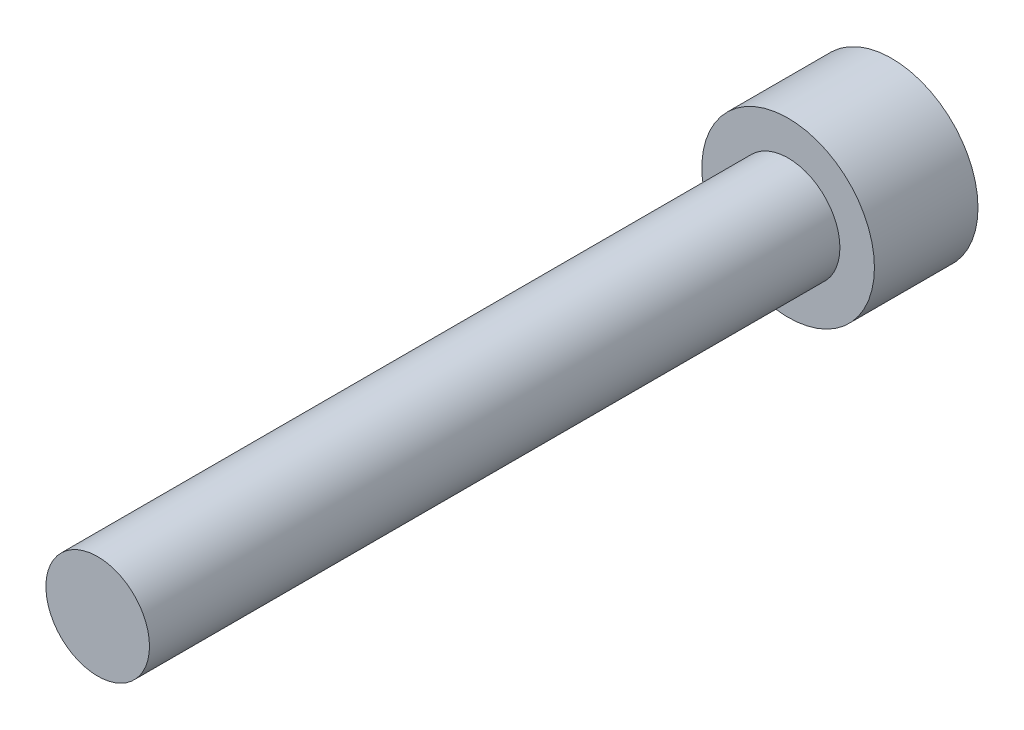
ISO-10303-21;
HEADER;
FILE_DESCRIPTION(('STEP AP214'),'2;1');
FILE_NAME('part.step','',(''),(''),'','','');
FILE_SCHEMA(('AUTOMOTIVE_DESIGN { 1 0 10303 214 1 1 1 1 }'));
ENDSEC;
DATA;
#1=APPLICATION_CONTEXT('core data for automotive mechanical design processes');
#2=APPLICATION_PROTOCOL_DEFINITION('international standard','automotive_design',2000,#1);
#3=PRODUCT_CONTEXT('',#1,'mechanical');
#4=PRODUCT('Part','Part','',(#3));
#5=PRODUCT_RELATED_PRODUCT_CATEGORY('part','',(#4));
#6=PRODUCT_DEFINITION_FORMATION('','',#4);
#7=PRODUCT_DEFINITION_CONTEXT('part definition',#1,'design');
#8=PRODUCT_DEFINITION('design','',#6,#7);
#9=PRODUCT_DEFINITION_SHAPE('','',#8);
#10=(LENGTH_UNIT() NAMED_UNIT(*) SI_UNIT(.MILLI.,.METRE.));
#11=(NAMED_UNIT(*) PLANE_ANGLE_UNIT() SI_UNIT($,.RADIAN.));
#12=(NAMED_UNIT(*) SI_UNIT($,.STERADIAN.) SOLID_ANGLE_UNIT());
#13=UNCERTAINTY_MEASURE_WITH_UNIT(LENGTH_MEASURE(1.E-05),#10,'distance_accuracy_value','');
#14=(GEOMETRIC_REPRESENTATION_CONTEXT(3) GLOBAL_UNCERTAINTY_ASSIGNED_CONTEXT((#13)) GLOBAL_UNIT_ASSIGNED_CONTEXT((#10,
#11,#12)) REPRESENTATION_CONTEXT('',''));
#15=CARTESIAN_POINT('',(0.,0.,0.));
#16=DIRECTION('',(0.,0.,1.));
#17=DIRECTION('',(1.,0.,0.));
#18=AXIS2_PLACEMENT_3D('',#15,#16,#17);
#19=CARTESIAN_POINT('',(0.,0.,6.));
#20=DIRECTION('',(0.,0.,1.));
#21=DIRECTION('',(1.,0.,0.));
#22=AXIS2_PLACEMENT_3D('',#19,#20,#21);
#23=PLANE('',#22);
#24=CARTESIAN_POINT('',(0.,0.,6.));
#25=DIRECTION('',(0.,0.,1.));
#26=DIRECTION('',(1.,0.,0.));
#27=AXIS2_PLACEMENT_3D('',#24,#25,#26);
#28=CIRCLE('',#27,5.);
#29=CARTESIAN_POINT('',(5.,0.,6.));
#30=VERTEX_POINT('',#29);
#31=EDGE_CURVE('E11',#30,#30,#28,.T.);
#32=ORIENTED_EDGE('',*,*,#31,.T.);
#33=EDGE_LOOP('',(#32));
#34=FACE_BOUND('',#33,.T.);
#35=CARTESIAN_POINT('',(0.,0.,6.));
#36=DIRECTION('',(0.,0.,1.));
#37=DIRECTION('',(1.,0.,0.));
#38=AXIS2_PLACEMENT_3D('',#35,#36,#37);
#39=CIRCLE('',#38,3.);
#40=CARTESIAN_POINT('',(3.,0.,6.));
#41=VERTEX_POINT('',#40);
#42=EDGE_CURVE('E139',#41,#41,#39,.T.);
#43=ORIENTED_EDGE('',*,*,#42,.F.);
#44=EDGE_LOOP('',(#43));
#45=FACE_BOUND('',#44,.T.);
#46=ADVANCED_FACE('F37',(#34,#45),#23,.T.);
#47=CARTESIAN_POINT('',(0.,0.,6.));
#48=DIRECTION('',(0.,0.,-1.));
#49=DIRECTION('',(-1.,0.,0.));
#50=AXIS2_PLACEMENT_3D('',#47,#48,#49);
#51=CYLINDRICAL_SURFACE('',#50,5.);
#52=ORIENTED_EDGE('',*,*,#31,.F.);
#53=EDGE_LOOP('',(#52));
#54=FACE_BOUND('',#53,.T.);
#55=CARTESIAN_POINT('',(0.,0.,0.));
#56=DIRECTION('',(0.,0.,1.));
#57=DIRECTION('',(1.,0.,0.));
#58=AXIS2_PLACEMENT_3D('',#55,#56,#57);
#59=CIRCLE('',#58,5.);
#60=CARTESIAN_POINT('',(5.,0.,0.));
#61=VERTEX_POINT('',#60);
#62=EDGE_CURVE('E41',#61,#61,#59,.T.);
#63=ORIENTED_EDGE('',*,*,#62,.T.);
#64=EDGE_LOOP('',(#63));
#65=FACE_BOUND('',#64,.T.);
#66=ADVANCED_FACE('F39',(#54,#65),#51,.T.);
#67=CARTESIAN_POINT('',(0.,0.,0.));
#68=DIRECTION('',(0.,0.,1.));
#69=DIRECTION('',(1.,0.,0.));
#70=AXIS2_PLACEMENT_3D('',#67,#68,#69);
#71=PLANE('',#70);
#72=DIRECTION('',(0.961310652096989,0.275466568143691,0.));
#73=VECTOR('',#72,1.);
#74=CARTESIAN_POINT('',(-2.44462819370027,2.36158950964695,0.));
#75=LINE('',#74,#73);
#76=CARTESIAN_POINT('',(-2.44462819370027,2.36158950964695,0.));
#77=VERTEX_POINT('',#76);
#78=CARTESIAN_POINT('',(0.822882411814956,3.29790487337557,0.));
#79=VERTEX_POINT('',#78);
#80=EDGE_CURVE('E126',#77,#79,#75,.T.);
#81=ORIENTED_EDGE('',*,*,#80,.F.);
#82=DIRECTION('',(0.242094280142741,0.970252729716422,0.));
#83=VECTOR('',#82,1.);
#84=CARTESIAN_POINT('',(-3.26751060551523,-0.936315363728624,0.));
#85=LINE('',#84,#83);
#86=CARTESIAN_POINT('',(-3.26751060551523,-0.936315363728624,0.));
#87=VERTEX_POINT('',#86);
#88=EDGE_CURVE('E52',#87,#77,#85,.T.);
#89=ORIENTED_EDGE('',*,*,#88,.F.);
#90=DIRECTION('',(-0.719216371954248,0.694786161572731,0.));
#91=VECTOR('',#90,1.);
#92=CARTESIAN_POINT('',(-0.822882411814958,-3.29790487337557,0.));
#93=LINE('',#92,#91);
#94=CARTESIAN_POINT('',(-0.822882411814958,-3.29790487337557,0.));
#95=VERTEX_POINT('',#94);
#96=EDGE_CURVE('E135',#95,#87,#93,.T.);
#97=ORIENTED_EDGE('',*,*,#96,.F.);
#98=DIRECTION('',(-0.961310652096989,-0.275466568143691,0.));
#99=VECTOR('',#98,1.);
#100=CARTESIAN_POINT('',(2.44462819370027,-2.36158950964695,0.));
#101=LINE('',#100,#99);
#102=CARTESIAN_POINT('',(2.44462819370027,-2.36158950964695,0.));
#103=VERTEX_POINT('',#102);
#104=EDGE_CURVE('E133',#103,#95,#101,.T.);
#105=ORIENTED_EDGE('',*,*,#104,.F.);
#106=DIRECTION('',(-0.242094280142741,-0.970252729716422,0.));
#107=VECTOR('',#106,1.);
#108=CARTESIAN_POINT('',(3.26751060551522,0.936315363728623,0.));
#109=LINE('',#108,#107);
#110=CARTESIAN_POINT('',(3.26751060551522,0.936315363728623,0.));
#111=VERTEX_POINT('',#110);
#112=EDGE_CURVE('E100',#111,#103,#109,.T.);
#113=ORIENTED_EDGE('',*,*,#112,.F.);
#114=DIRECTION('',(0.719216371954247,-0.694786161572731,0.));
#115=VECTOR('',#114,1.);
#116=CARTESIAN_POINT('',(0.822882411814956,3.29790487337557,0.));
#117=LINE('',#116,#115);
#118=EDGE_CURVE('E129',#79,#111,#117,.T.);
#119=ORIENTED_EDGE('',*,*,#118,.F.);
#120=EDGE_LOOP('',(#81,#89,#97,#105,#113,#119));
#121=FACE_BOUND('',#120,.T.);
#122=ORIENTED_EDGE('',*,*,#62,.F.);
#123=EDGE_LOOP('',(#122));
#124=FACE_BOUND('',#123,.T.);
#125=ADVANCED_FACE('F159',(#121,#124),#71,.F.);
#126=CARTESIAN_POINT('',(0.,0.,46.));
#127=DIRECTION('',(0.,0.,-1.));
#128=DIRECTION('',(-1.,0.,0.));
#129=AXIS2_PLACEMENT_3D('',#126,#127,#128);
#130=CYLINDRICAL_SURFACE('',#129,3.);
#131=CARTESIAN_POINT('',(0.,0.,46.));
#132=DIRECTION('',(0.,0.,1.));
#133=DIRECTION('',(1.,0.,0.));
#134=AXIS2_PLACEMENT_3D('',#131,#132,#133);
#135=CIRCLE('',#134,3.);
#136=CARTESIAN_POINT('',(3.,0.,46.));
#137=VERTEX_POINT('',#136);
#138=EDGE_CURVE('E145',#137,#137,#135,.T.);
#139=ORIENTED_EDGE('',*,*,#138,.F.);
#140=EDGE_LOOP('',(#139));
#141=FACE_BOUND('',#140,.T.);
#142=ORIENTED_EDGE('',*,*,#42,.T.);
#143=EDGE_LOOP('',(#142));
#144=FACE_BOUND('',#143,.T.);
#145=ADVANCED_FACE('F151',(#141,#144),#130,.T.);
#146=CARTESIAN_POINT('',(0.,0.,46.));
#147=DIRECTION('',(0.,0.,1.));
#148=DIRECTION('',(1.,0.,0.));
#149=AXIS2_PLACEMENT_3D('',#146,#147,#148);
#150=PLANE('',#149);
#151=ORIENTED_EDGE('',*,*,#138,.T.);
#152=EDGE_LOOP('',(#151));
#153=FACE_BOUND('',#152,.T.);
#154=ADVANCED_FACE('F168',(#153),#150,.T.);
#155=CARTESIAN_POINT('',(-3.26751060551523,-0.936315363728624,3.));
#156=DIRECTION('',(-0.970252729716422,0.242094280142741,0.));
#157=DIRECTION('',(-0.242094280142741,-0.970252729716422,0.));
#158=AXIS2_PLACEMENT_3D('',#155,#156,#157);
#159=PLANE('',#158);
#160=ORIENTED_EDGE('',*,*,#88,.T.);
#161=DIRECTION('',(0.,0.,-1.));
#162=VECTOR('',#161,1.);
#163=CARTESIAN_POINT('',(-2.44462819370027,2.36158950964695,3.));
#164=LINE('',#163,#162);
#165=CARTESIAN_POINT('',(-2.44462819370027,2.36158950964695,3.));
#166=VERTEX_POINT('',#165);
#167=EDGE_CURVE('E82',#166,#77,#164,.T.);
#168=ORIENTED_EDGE('',*,*,#167,.F.);
#169=DIRECTION('',(0.242094280142741,0.970252729716422,0.));
#170=VECTOR('',#169,1.);
#171=CARTESIAN_POINT('',(-3.26751060551523,-0.936315363728624,3.));
#172=LINE('',#171,#170);
#173=CARTESIAN_POINT('',(-3.26751060551523,-0.936315363728624,3.));
#174=VERTEX_POINT('',#173);
#175=EDGE_CURVE('E137',#174,#166,#172,.T.);
#176=ORIENTED_EDGE('',*,*,#175,.F.);
#177=DIRECTION('',(0.,0.,-1.));
#178=VECTOR('',#177,1.);
#179=CARTESIAN_POINT('',(-3.26751060551523,-0.936315363728624,3.));
#180=LINE('',#179,#178);
#181=EDGE_CURVE('E60',#174,#87,#180,.T.);
#182=ORIENTED_EDGE('',*,*,#181,.T.);
#183=EDGE_LOOP('',(#160,#168,#176,#182));
#184=FACE_BOUND('',#183,.T.);
#185=ADVANCED_FACE('F180',(#184),#159,.F.);
#186=CARTESIAN_POINT('',(-0.822882411814958,-3.29790487337557,3.));
#187=DIRECTION('',(-0.694786161572731,-0.719216371954248,0.));
#188=DIRECTION('',(0.719216371954248,-0.694786161572731,0.));
#189=AXIS2_PLACEMENT_3D('',#186,#187,#188);
#190=PLANE('',#189);
#191=ORIENTED_EDGE('',*,*,#96,.T.);
#192=ORIENTED_EDGE('',*,*,#181,.F.);
#193=DIRECTION('',(-0.719216371954248,0.694786161572731,0.));
#194=VECTOR('',#193,1.);
#195=CARTESIAN_POINT('',(-0.822882411814958,-3.29790487337557,3.));
#196=LINE('',#195,#194);
#197=CARTESIAN_POINT('',(-0.822882411814958,-3.29790487337557,3.));
#198=VERTEX_POINT('',#197);
#199=EDGE_CURVE('E112',#198,#174,#196,.T.);
#200=ORIENTED_EDGE('',*,*,#199,.F.);
#201=DIRECTION('',(0.,0.,-1.));
#202=VECTOR('',#201,1.);
#203=CARTESIAN_POINT('',(-0.822882411814958,-3.29790487337557,3.));
#204=LINE('',#203,#202);
#205=EDGE_CURVE('E104',#198,#95,#204,.T.);
#206=ORIENTED_EDGE('',*,*,#205,.T.);
#207=EDGE_LOOP('',(#191,#192,#200,#206));
#208=FACE_BOUND('',#207,.T.);
#209=ADVANCED_FACE('F182',(#208),#190,.F.);
#210=CARTESIAN_POINT('',(2.44462819370027,-2.36158950964695,3.));
#211=DIRECTION('',(0.275466568143691,-0.961310652096988,0.));
#212=DIRECTION('',(0.961310652096989,0.275466568143691,0.));
#213=AXIS2_PLACEMENT_3D('',#210,#211,#212);
#214=PLANE('',#213);
#215=ORIENTED_EDGE('',*,*,#104,.T.);
#216=ORIENTED_EDGE('',*,*,#205,.F.);
#217=DIRECTION('',(-0.961310652096989,-0.275466568143691,0.));
#218=VECTOR('',#217,1.);
#219=CARTESIAN_POINT('',(2.44462819370027,-2.36158950964695,3.));
#220=LINE('',#219,#218);
#221=CARTESIAN_POINT('',(2.44462819370027,-2.36158950964695,3.));
#222=VERTEX_POINT('',#221);
#223=EDGE_CURVE('E108',#222,#198,#220,.T.);
#224=ORIENTED_EDGE('',*,*,#223,.F.);
#225=DIRECTION('',(0.,0.,-1.));
#226=VECTOR('',#225,1.);
#227=CARTESIAN_POINT('',(2.44462819370027,-2.36158950964695,3.));
#228=LINE('',#227,#226);
#229=EDGE_CURVE('E93',#222,#103,#228,.T.);
#230=ORIENTED_EDGE('',*,*,#229,.T.);
#231=EDGE_LOOP('',(#215,#216,#224,#230));
#232=FACE_BOUND('',#231,.T.);
#233=ADVANCED_FACE('F109',(#232),#214,.F.);
#234=CARTESIAN_POINT('',(3.26751060551522,0.936315363728623,3.));
#235=DIRECTION('',(0.970252729716422,-0.242094280142741,0.));
#236=DIRECTION('',(0.242094280142741,0.970252729716422,0.));
#237=AXIS2_PLACEMENT_3D('',#234,#235,#236);
#238=PLANE('',#237);
#239=ORIENTED_EDGE('',*,*,#112,.T.);
#240=ORIENTED_EDGE('',*,*,#229,.F.);
#241=DIRECTION('',(-0.242094280142741,-0.970252729716422,0.));
#242=VECTOR('',#241,1.);
#243=CARTESIAN_POINT('',(3.26751060551522,0.936315363728623,3.));
#244=LINE('',#243,#242);
#245=CARTESIAN_POINT('',(3.26751060551522,0.936315363728623,3.));
#246=VERTEX_POINT('',#245);
#247=EDGE_CURVE('E97',#246,#222,#244,.T.);
#248=ORIENTED_EDGE('',*,*,#247,.F.);
#249=DIRECTION('',(0.,0.,-1.));
#250=VECTOR('',#249,1.);
#251=CARTESIAN_POINT('',(3.26751060551522,0.936315363728623,3.));
#252=LINE('',#251,#250);
#253=EDGE_CURVE('E105',#246,#111,#252,.T.);
#254=ORIENTED_EDGE('',*,*,#253,.T.);
#255=EDGE_LOOP('',(#239,#240,#248,#254));
#256=FACE_BOUND('',#255,.T.);
#257=ADVANCED_FACE('F95',(#256),#238,.F.);
#258=CARTESIAN_POINT('',(0.822882411814956,3.29790487337557,3.));
#259=DIRECTION('',(0.694786161572731,0.719216371954248,0.));
#260=DIRECTION('',(-0.719216371954248,0.694786161572731,0.));
#261=AXIS2_PLACEMENT_3D('',#258,#259,#260);
#262=PLANE('',#261);
#263=ORIENTED_EDGE('',*,*,#118,.T.);
#264=ORIENTED_EDGE('',*,*,#253,.F.);
#265=DIRECTION('',(0.719216371954247,-0.694786161572731,0.));
#266=VECTOR('',#265,1.);
#267=CARTESIAN_POINT('',(0.822882411814956,3.29790487337557,3.));
#268=LINE('',#267,#266);
#269=CARTESIAN_POINT('',(0.822882411814956,3.29790487337557,3.));
#270=VERTEX_POINT('',#269);
#271=EDGE_CURVE('E118',#270,#246,#268,.T.);
#272=ORIENTED_EDGE('',*,*,#271,.F.);
#273=DIRECTION('',(0.,0.,-1.));
#274=VECTOR('',#273,1.);
#275=CARTESIAN_POINT('',(0.822882411814956,3.29790487337557,3.));
#276=LINE('',#275,#274);
#277=EDGE_CURVE('E142',#270,#79,#276,.T.);
#278=ORIENTED_EDGE('',*,*,#277,.T.);
#279=EDGE_LOOP('',(#263,#264,#272,#278));
#280=FACE_BOUND('',#279,.T.);
#281=ADVANCED_FACE('F193',(#280),#262,.F.);
#282=CARTESIAN_POINT('',(-2.44462819370027,2.36158950964695,3.));
#283=DIRECTION('',(-0.275466568143691,0.961310652096988,0.));
#284=DIRECTION('',(-0.961310652096989,-0.275466568143691,0.));
#285=AXIS2_PLACEMENT_3D('',#282,#283,#284);
#286=PLANE('',#285);
#287=ORIENTED_EDGE('',*,*,#80,.T.);
#288=ORIENTED_EDGE('',*,*,#277,.F.);
#289=DIRECTION('',(0.961310652096989,0.275466568143691,0.));
#290=VECTOR('',#289,1.);
#291=CARTESIAN_POINT('',(-2.44462819370027,2.36158950964695,3.));
#292=LINE('',#291,#290);
#293=EDGE_CURVE('E120',#166,#270,#292,.T.);
#294=ORIENTED_EDGE('',*,*,#293,.F.);
#295=ORIENTED_EDGE('',*,*,#167,.T.);
#296=EDGE_LOOP('',(#287,#288,#294,#295));
#297=FACE_BOUND('',#296,.T.);
#298=ADVANCED_FACE('F178',(#297),#286,.F.);
#299=CARTESIAN_POINT('',(0.,0.,3.));
#300=DIRECTION('',(0.,0.,-1.));
#301=DIRECTION('',(-1.,0.,0.));
#302=AXIS2_PLACEMENT_3D('',#299,#300,#301);
#303=PLANE('',#302);
#304=ORIENTED_EDGE('',*,*,#175,.T.);
#305=ORIENTED_EDGE('',*,*,#293,.T.);
#306=ORIENTED_EDGE('',*,*,#271,.T.);
#307=ORIENTED_EDGE('',*,*,#247,.T.);
#308=ORIENTED_EDGE('',*,*,#223,.T.);
#309=ORIENTED_EDGE('',*,*,#199,.T.);
#310=EDGE_LOOP('',(#304,#305,#306,#307,#308,#309));
#311=FACE_BOUND('',#310,.T.);
#312=ADVANCED_FACE('F115',(#311),#303,.T.);
#313=CLOSED_SHELL('',(#46,#66,#125,#145,#154,#185,#209,#233,#257,#281,#298,#312));
#314=MANIFOLD_SOLID_BREP('B2',#313);
#315=ADVANCED_BREP_SHAPE_REPRESENTATION('',(#18,#314),#14);
#316=SHAPE_DEFINITION_REPRESENTATION(#9,#315);
ENDSEC;
END-ISO-10303-21;
